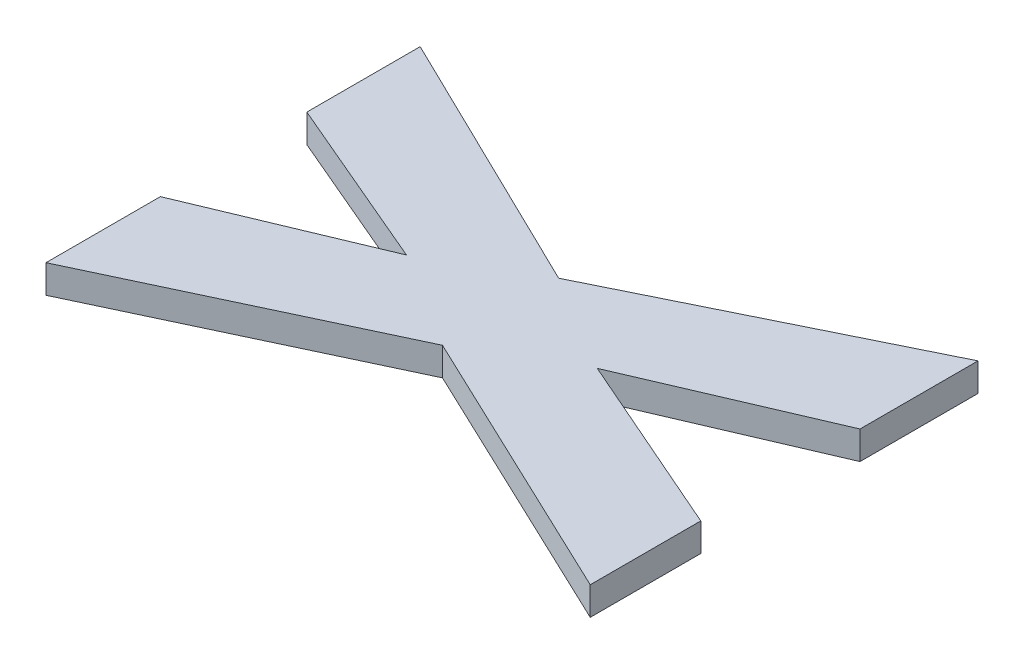
ISO-10303-21;
HEADER;
FILE_DESCRIPTION(('STEP AP214'),'2;1');
FILE_NAME('part.step','',(''),(''),'','','');
FILE_SCHEMA(('AUTOMOTIVE_DESIGN { 1 0 10303 214 1 1 1 1 }'));
ENDSEC;
DATA;
#1=APPLICATION_CONTEXT('core data for automotive mechanical design processes');
#2=APPLICATION_PROTOCOL_DEFINITION('international standard','automotive_design',2000,#1);
#3=PRODUCT_CONTEXT('',#1,'mechanical');
#4=PRODUCT('Part','Part','',(#3));
#5=PRODUCT_RELATED_PRODUCT_CATEGORY('part','',(#4));
#6=PRODUCT_DEFINITION_FORMATION('','',#4);
#7=PRODUCT_DEFINITION_CONTEXT('part definition',#1,'design');
#8=PRODUCT_DEFINITION('design','',#6,#7);
#9=PRODUCT_DEFINITION_SHAPE('','',#8);
#10=(LENGTH_UNIT() NAMED_UNIT(*) SI_UNIT(.MILLI.,.METRE.));
#11=(NAMED_UNIT(*) PLANE_ANGLE_UNIT() SI_UNIT($,.RADIAN.));
#12=(NAMED_UNIT(*) SI_UNIT($,.STERADIAN.) SOLID_ANGLE_UNIT());
#13=UNCERTAINTY_MEASURE_WITH_UNIT(LENGTH_MEASURE(1.E-05),#10,'distance_accuracy_value','');
#14=(GEOMETRIC_REPRESENTATION_CONTEXT(3) GLOBAL_UNCERTAINTY_ASSIGNED_CONTEXT((#13)) GLOBAL_UNIT_ASSIGNED_CONTEXT((#10,
#11,#12)) REPRESENTATION_CONTEXT('',''));
#15=CARTESIAN_POINT('',(0.,0.,0.));
#16=DIRECTION('',(0.,0.,1.));
#17=DIRECTION('',(1.,0.,0.));
#18=AXIS2_PLACEMENT_3D('',#15,#16,#17);
#19=CARTESIAN_POINT('',(2.3542541336,2.9906,4.9916557850555));
#20=DIRECTION('',(1.,0.,0.));
#21=DIRECTION('',(0.,-1.,0.));
#22=AXIS2_PLACEMENT_3D('',#19,#20,#21);
#23=PLANE('',#22);
#24=DIRECTION('',(0.,0.,1.));
#25=VECTOR('',#24,1.);
#26=CARTESIAN_POINT('',(2.3542541336,2.9306,4.9916557850555));
#27=LINE('',#26,#25);
#28=CARTESIAN_POINT('',(2.3542541336,2.9306,4.9916557850555));
#29=VERTEX_POINT('',#28);
#30=CARTESIAN_POINT('',(2.3542541336,2.9306,5.2263780072777));
#31=VERTEX_POINT('',#30);
#32=EDGE_CURVE('E11',#29,#31,#27,.T.);
#33=ORIENTED_EDGE('',*,*,#32,.F.);
#34=DIRECTION('',(0.,-1.,0.));
#35=VECTOR('',#34,1.);
#36=CARTESIAN_POINT('',(2.3542541336,2.9906,4.9916557850555));
#37=LINE('',#36,#35);
#38=CARTESIAN_POINT('',(2.3542541336,2.9906,4.9916557850555));
#39=VERTEX_POINT('',#38);
#40=EDGE_CURVE('E24',#39,#29,#37,.T.);
#41=ORIENTED_EDGE('',*,*,#40,.F.);
#42=DIRECTION('',(0.,0.,1.));
#43=VECTOR('',#42,1.);
#44=CARTESIAN_POINT('',(2.3542541336,2.9906,4.9916557850555));
#45=LINE('',#44,#43);
#46=CARTESIAN_POINT('',(2.3542541336,2.9906,5.2263780072777));
#47=VERTEX_POINT('',#46);
#48=EDGE_CURVE('E209',#39,#47,#45,.T.);
#49=ORIENTED_EDGE('',*,*,#48,.T.);
#50=DIRECTION('',(0.,-1.,0.));
#51=VECTOR('',#50,1.);
#52=CARTESIAN_POINT('',(2.3542541336,2.9906,5.2263780072777));
#53=LINE('',#52,#51);
#54=EDGE_CURVE('E126',#47,#31,#53,.T.);
#55=ORIENTED_EDGE('',*,*,#54,.T.);
#56=EDGE_LOOP('',(#33,#41,#49,#55));
#57=FACE_BOUND('',#56,.T.);
#58=ADVANCED_FACE('F17',(#57),#23,.T.);
#59=CARTESIAN_POINT('',(1.9638027447111,2.9906,4.8210307850555));
#60=DIRECTION('',(0.400429795051687,0.,-0.916327441057433));
#61=DIRECTION('',(-0.916327441057433,0.,-0.400429795051687));
#62=AXIS2_PLACEMENT_3D('',#59,#60,#61);
#63=PLANE('',#62);
#64=DIRECTION('',(0.916327441057433,0.,0.400429795051687));
#65=VECTOR('',#64,1.);
#66=CARTESIAN_POINT('',(1.9638027447111,2.9306,4.8210307850555));
#67=LINE('',#66,#65);
#68=CARTESIAN_POINT('',(1.9638027447111,2.9306,4.8210307850555));
#69=VERTEX_POINT('',#68);
#70=EDGE_CURVE('E206',#69,#29,#67,.T.);
#71=ORIENTED_EDGE('',*,*,#70,.F.);
#72=DIRECTION('',(0.,-1.,0.));
#73=VECTOR('',#72,1.);
#74=CARTESIAN_POINT('',(1.9638027447111,2.9906,4.8210307850555));
#75=LINE('',#74,#73);
#76=CARTESIAN_POINT('',(1.9638027447111,2.9906,4.8210307850555));
#77=VERTEX_POINT('',#76);
#78=EDGE_CURVE('E203',#77,#69,#75,.T.);
#79=ORIENTED_EDGE('',*,*,#78,.F.);
#80=DIRECTION('',(0.916327441057433,0.,0.400429795051687));
#81=VECTOR('',#80,1.);
#82=CARTESIAN_POINT('',(1.9638027447111,2.9906,4.8210307850555));
#83=LINE('',#82,#81);
#84=EDGE_CURVE('E200',#77,#39,#83,.T.);
#85=ORIENTED_EDGE('',*,*,#84,.T.);
#86=ORIENTED_EDGE('',*,*,#40,.T.);
#87=EDGE_LOOP('',(#71,#79,#85,#86));
#88=FACE_BOUND('',#87,.T.);
#89=ADVANCED_FACE('F211',(#88),#63,.T.);
#90=CARTESIAN_POINT('',(2.3542541336,2.9906,4.6535655072777));
#91=DIRECTION('',(0.394175741112366,0.,0.919035083725598));
#92=DIRECTION('',(0.919035083725598,0.,-0.394175741112366));
#93=AXIS2_PLACEMENT_3D('',#90,#91,#92);
#94=PLANE('',#93);
#95=DIRECTION('',(-0.919035083725598,0.,0.394175741112366));
#96=VECTOR('',#95,1.);
#97=CARTESIAN_POINT('',(2.3542541336,2.9306,4.6535655072777));
#98=LINE('',#97,#96);
#99=CARTESIAN_POINT('',(2.3542541336,2.9306,4.6535655072777));
#100=VERTEX_POINT('',#99);
#101=EDGE_CURVE('E197',#100,#69,#98,.T.);
#102=ORIENTED_EDGE('',*,*,#101,.F.);
#103=DIRECTION('',(0.,-1.,0.));
#104=VECTOR('',#103,1.);
#105=CARTESIAN_POINT('',(2.3542541336,2.9906,4.6535655072777));
#106=LINE('',#105,#104);
#107=CARTESIAN_POINT('',(2.3542541336,2.9906,4.6535655072777));
#108=VERTEX_POINT('',#107);
#109=EDGE_CURVE('E194',#108,#100,#106,.T.);
#110=ORIENTED_EDGE('',*,*,#109,.F.);
#111=DIRECTION('',(-0.919035083725598,0.,0.394175741112366));
#112=VECTOR('',#111,1.);
#113=CARTESIAN_POINT('',(2.3542541336,2.9906,4.6535655072777));
#114=LINE('',#113,#112);
#115=EDGE_CURVE('E191',#108,#77,#114,.T.);
#116=ORIENTED_EDGE('',*,*,#115,.T.);
#117=ORIENTED_EDGE('',*,*,#78,.T.);
#118=EDGE_LOOP('',(#102,#110,#116,#117));
#119=FACE_BOUND('',#118,.T.);
#120=ADVANCED_FACE('F215',(#119),#94,.T.);
#121=CARTESIAN_POINT('',(2.3542541336,2.9906,4.4030446739444));
#122=DIRECTION('',(1.,0.,0.));
#123=DIRECTION('',(0.,-1.,0.));
#124=AXIS2_PLACEMENT_3D('',#121,#122,#123);
#125=PLANE('',#124);
#126=DIRECTION('',(0.,0.,1.));
#127=VECTOR('',#126,1.);
#128=CARTESIAN_POINT('',(2.3542541336,2.9306,4.4030446739444));
#129=LINE('',#128,#127);
#130=CARTESIAN_POINT('',(2.3542541336,2.9306,4.4030446739444));
#131=VERTEX_POINT('',#130);
#132=EDGE_CURVE('E188',#131,#100,#129,.T.);
#133=ORIENTED_EDGE('',*,*,#132,.F.);
#134=DIRECTION('',(0.,-1.,0.));
#135=VECTOR('',#134,1.);
#136=CARTESIAN_POINT('',(2.3542541336,2.9906,4.4030446739444));
#137=LINE('',#136,#135);
#138=CARTESIAN_POINT('',(2.3542541336,2.9906,4.4030446739444));
#139=VERTEX_POINT('',#138);
#140=EDGE_CURVE('E185',#139,#131,#137,.T.);
#141=ORIENTED_EDGE('',*,*,#140,.F.);
#142=DIRECTION('',(0.,0.,1.));
#143=VECTOR('',#142,1.);
#144=CARTESIAN_POINT('',(2.3542541336,2.9906,4.4030446739444));
#145=LINE('',#144,#143);
#146=EDGE_CURVE('E182',#139,#108,#145,.T.);
#147=ORIENTED_EDGE('',*,*,#146,.T.);
#148=ORIENTED_EDGE('',*,*,#109,.T.);
#149=EDGE_LOOP('',(#133,#141,#147,#148));
#150=FACE_BOUND('',#149,.T.);
#151=ADVANCED_FACE('F218',(#150),#125,.T.);
#152=CARTESIAN_POINT('',(1.7570666336,2.9906,4.6962217572777));
#153=DIRECTION('',(-0.440688101753024,0.,-0.897660290406854));
#154=DIRECTION('',(-0.897660290406854,0.,0.440688101753024));
#155=AXIS2_PLACEMENT_3D('',#152,#153,#154);
#156=PLANE('',#155);
#157=DIRECTION('',(0.897660290406854,0.,-0.440688101753024));
#158=VECTOR('',#157,1.);
#159=CARTESIAN_POINT('',(1.7570666336,2.9306,4.6962217572777));
#160=LINE('',#159,#158);
#161=CARTESIAN_POINT('',(1.7570666336,2.9306,4.6962217572777));
#162=VERTEX_POINT('',#161);
#163=EDGE_CURVE('E179',#162,#131,#160,.T.);
#164=ORIENTED_EDGE('',*,*,#163,.F.);
#165=DIRECTION('',(0.,-1.,0.));
#166=VECTOR('',#165,1.);
#167=CARTESIAN_POINT('',(1.7570666336,2.9906,4.6962217572777));
#168=LINE('',#167,#166);
#169=CARTESIAN_POINT('',(1.7570666336,2.9906,4.6962217572777));
#170=VERTEX_POINT('',#169);
#171=EDGE_CURVE('E176',#170,#162,#168,.T.);
#172=ORIENTED_EDGE('',*,*,#171,.F.);
#173=DIRECTION('',(0.897660290406854,0.,-0.440688101753024));
#174=VECTOR('',#173,1.);
#175=CARTESIAN_POINT('',(1.7570666336,2.9906,4.6962217572777));
#176=LINE('',#175,#174);
#177=EDGE_CURVE('E173',#170,#139,#176,.T.);
#178=ORIENTED_EDGE('',*,*,#177,.T.);
#179=ORIENTED_EDGE('',*,*,#140,.T.);
#180=EDGE_LOOP('',(#164,#172,#178,#179));
#181=FACE_BOUND('',#180,.T.);
#182=ADVANCED_FACE('F223',(#181),#156,.T.);
#183=CARTESIAN_POINT('',(1.1842541336,2.9906,4.4174891183888));
#184=DIRECTION('',(0.437550889322182,0.,-0.899193649473442));
#185=DIRECTION('',(-0.899193649473442,0.,-0.437550889322182));
#186=AXIS2_PLACEMENT_3D('',#183,#184,#185);
#187=PLANE('',#186);
#188=DIRECTION('',(0.899193649473442,0.,0.437550889322182));
#189=VECTOR('',#188,1.);
#190=CARTESIAN_POINT('',(1.1842541336,2.9306,4.4174891183888));
#191=LINE('',#190,#189);
#192=CARTESIAN_POINT('',(1.1842541336,2.9306,4.4174891183888));
#193=VERTEX_POINT('',#192);
#194=EDGE_CURVE('E170',#193,#162,#191,.T.);
#195=ORIENTED_EDGE('',*,*,#194,.F.);
#196=DIRECTION('',(0.,-1.,0.));
#197=VECTOR('',#196,1.);
#198=CARTESIAN_POINT('',(1.1842541336,2.9906,4.4174891183888));
#199=LINE('',#198,#197);
#200=CARTESIAN_POINT('',(1.1842541336,2.9906,4.4174891183888));
#201=VERTEX_POINT('',#200);
#202=EDGE_CURVE('E167',#201,#193,#199,.T.);
#203=ORIENTED_EDGE('',*,*,#202,.F.);
#204=DIRECTION('',(0.899193649473442,0.,0.437550889322182));
#205=VECTOR('',#204,1.);
#206=CARTESIAN_POINT('',(1.1842541336,2.9906,4.4174891183888));
#207=LINE('',#206,#205);
#208=EDGE_CURVE('E164',#201,#170,#207,.T.);
#209=ORIENTED_EDGE('',*,*,#208,.T.);
#210=ORIENTED_EDGE('',*,*,#171,.T.);
#211=EDGE_LOOP('',(#195,#203,#209,#210));
#212=FACE_BOUND('',#211,.T.);
#213=ADVANCED_FACE('F225',(#212),#187,.T.);
#214=CARTESIAN_POINT('',(1.1842541336,2.9906,4.6580793961666));
#215=DIRECTION('',(-1.,0.,0.));
#216=DIRECTION('',(0.,1.,0.));
#217=AXIS2_PLACEMENT_3D('',#214,#215,#216);
#218=PLANE('',#217);
#219=DIRECTION('',(0.,0.,-1.));
#220=VECTOR('',#219,1.);
#221=CARTESIAN_POINT('',(1.1842541336,2.9306,4.6580793961666));
#222=LINE('',#221,#220);
#223=CARTESIAN_POINT('',(1.1842541336,2.9306,4.6580793961666));
#224=VERTEX_POINT('',#223);
#225=EDGE_CURVE('E161',#224,#193,#222,.T.);
#226=ORIENTED_EDGE('',*,*,#225,.F.);
#227=DIRECTION('',(0.,-1.,0.));
#228=VECTOR('',#227,1.);
#229=CARTESIAN_POINT('',(1.1842541336,2.9906,4.6580793961666));
#230=LINE('',#229,#228);
#231=CARTESIAN_POINT('',(1.1842541336,2.9906,4.6580793961666));
#232=VERTEX_POINT('',#231);
#233=EDGE_CURVE('E158',#232,#224,#230,.T.);
#234=ORIENTED_EDGE('',*,*,#233,.F.);
#235=DIRECTION('',(0.,0.,-1.));
#236=VECTOR('',#235,1.);
#237=CARTESIAN_POINT('',(1.1842541336,2.9906,4.6580793961666));
#238=LINE('',#237,#236);
#239=EDGE_CURVE('E155',#232,#201,#238,.T.);
#240=ORIENTED_EDGE('',*,*,#239,.T.);
#241=ORIENTED_EDGE('',*,*,#202,.T.);
#242=EDGE_LOOP('',(#226,#234,#240,#241));
#243=FACE_BOUND('',#242,.T.);
#244=ADVANCED_FACE('F227',(#243),#218,.T.);
#245=CARTESIAN_POINT('',(1.5528131613777,2.9906,4.8151627294999));
#246=DIRECTION('',(-0.39208281014381,0.,0.919929926673621));
#247=DIRECTION('',(0.919929926673621,0.,0.39208281014381));
#248=AXIS2_PLACEMENT_3D('',#245,#246,#247);
#249=PLANE('',#248);
#250=DIRECTION('',(-0.919929926673621,0.,-0.39208281014381));
#251=VECTOR('',#250,1.);
#252=CARTESIAN_POINT('',(1.5528131613777,2.9306,4.8151627294999));
#253=LINE('',#252,#251);
#254=CARTESIAN_POINT('',(1.5528131613777,2.9306,4.8151627294999));
#255=VERTEX_POINT('',#254);
#256=EDGE_CURVE('E152',#255,#224,#253,.T.);
#257=ORIENTED_EDGE('',*,*,#256,.F.);
#258=DIRECTION('',(0.,-1.,0.));
#259=VECTOR('',#258,1.);
#260=CARTESIAN_POINT('',(1.5528131613777,2.9906,4.8151627294999));
#261=LINE('',#260,#259);
#262=CARTESIAN_POINT('',(1.5528131613777,2.9906,4.8151627294999));
#263=VERTEX_POINT('',#262);
#264=EDGE_CURVE('E149',#263,#255,#261,.T.);
#265=ORIENTED_EDGE('',*,*,#264,.F.);
#266=DIRECTION('',(-0.919929926673621,0.,-0.39208281014381));
#267=VECTOR('',#266,1.);
#268=CARTESIAN_POINT('',(1.5528131613777,2.9906,4.8151627294999));
#269=LINE('',#268,#267);
#270=EDGE_CURVE('E146',#263,#232,#269,.T.);
#271=ORIENTED_EDGE('',*,*,#270,.T.);
#272=ORIENTED_EDGE('',*,*,#233,.T.);
#273=EDGE_LOOP('',(#257,#265,#271,#272));
#274=FACE_BOUND('',#273,.T.);
#275=ADVANCED_FACE('F230',(#274),#249,.T.);
#276=CARTESIAN_POINT('',(1.1842541336,2.9906,4.969086340611));
#277=DIRECTION('',(-0.385377596123312,0.,-0.922758965497609));
#278=DIRECTION('',(-0.922758965497609,0.,0.385377596123312));
#279=AXIS2_PLACEMENT_3D('',#276,#277,#278);
#280=PLANE('',#279);
#281=DIRECTION('',(0.922758965497609,0.,-0.385377596123312));
#282=VECTOR('',#281,1.);
#283=CARTESIAN_POINT('',(1.1842541336,2.9306,4.969086340611));
#284=LINE('',#283,#282);
#285=CARTESIAN_POINT('',(1.1842541336,2.9306,4.969086340611));
#286=VERTEX_POINT('',#285);
#287=EDGE_CURVE('E143',#286,#255,#284,.T.);
#288=ORIENTED_EDGE('',*,*,#287,.F.);
#289=DIRECTION('',(0.,-1.,0.));
#290=VECTOR('',#289,1.);
#291=CARTESIAN_POINT('',(1.1842541336,2.9906,4.969086340611));
#292=LINE('',#291,#290);
#293=CARTESIAN_POINT('',(1.1842541336,2.9906,4.969086340611));
#294=VERTEX_POINT('',#293);
#295=EDGE_CURVE('E140',#294,#286,#292,.T.);
#296=ORIENTED_EDGE('',*,*,#295,.F.);
#297=DIRECTION('',(0.922758965497609,0.,-0.385377596123312));
#298=VECTOR('',#297,1.);
#299=CARTESIAN_POINT('',(1.1842541336,2.9906,4.969086340611));
#300=LINE('',#299,#298);
#301=EDGE_CURVE('E137',#294,#263,#300,.T.);
#302=ORIENTED_EDGE('',*,*,#301,.T.);
#303=ORIENTED_EDGE('',*,*,#264,.T.);
#304=EDGE_LOOP('',(#288,#296,#302,#303));
#305=FACE_BOUND('',#304,.T.);
#306=ADVANCED_FACE('F233',(#305),#280,.T.);
#307=CARTESIAN_POINT('',(1.1842541336,2.9906,5.2119335628332));
#308=DIRECTION('',(-1.,0.,0.));
#309=DIRECTION('',(0.,1.,0.));
#310=AXIS2_PLACEMENT_3D('',#307,#308,#309);
#311=PLANE('',#310);
#312=DIRECTION('',(0.,0.,-1.));
#313=VECTOR('',#312,1.);
#314=CARTESIAN_POINT('',(1.1842541336,2.9306,5.2119335628332));
#315=LINE('',#314,#313);
#316=CARTESIAN_POINT('',(1.1842541336,2.9306,5.2119335628332));
#317=VERTEX_POINT('',#316);
#318=EDGE_CURVE('E134',#317,#286,#315,.T.);
#319=ORIENTED_EDGE('',*,*,#318,.F.);
#320=DIRECTION('',(0.,-1.,0.));
#321=VECTOR('',#320,1.);
#322=CARTESIAN_POINT('',(1.1842541336,2.9906,5.2119335628332));
#323=LINE('',#322,#321);
#324=CARTESIAN_POINT('',(1.1842541336,2.9906,5.2119335628332));
#325=VERTEX_POINT('',#324);
#326=EDGE_CURVE('E132',#325,#317,#323,.T.);
#327=ORIENTED_EDGE('',*,*,#326,.F.);
#328=DIRECTION('',(0.,0.,-1.));
#329=VECTOR('',#328,1.);
#330=CARTESIAN_POINT('',(1.1842541336,2.9906,5.2119335628332));
#331=LINE('',#330,#329);
#332=EDGE_CURVE('E121',#325,#294,#331,.T.);
#333=ORIENTED_EDGE('',*,*,#332,.T.);
#334=ORIENTED_EDGE('',*,*,#295,.T.);
#335=EDGE_LOOP('',(#319,#327,#333,#334));
#336=FACE_BOUND('',#335,.T.);
#337=ADVANCED_FACE('F235',(#336),#311,.T.);
#338=CARTESIAN_POINT('',(1.7570666336,2.9906,4.9429057850555));
#339=DIRECTION('',(0.425109909729269,0.,0.905141737326245));
#340=DIRECTION('',(0.905141737326245,0.,-0.425109909729269));
#341=AXIS2_PLACEMENT_3D('',#338,#339,#340);
#342=PLANE('',#341);
#343=DIRECTION('',(-0.905141737326245,0.,0.425109909729269));
#344=VECTOR('',#343,1.);
#345=CARTESIAN_POINT('',(1.7570666336,2.9306,4.9429057850555));
#346=LINE('',#345,#344);
#347=CARTESIAN_POINT('',(1.7570666336,2.9306,4.9429057850555));
#348=VERTEX_POINT('',#347);
#349=EDGE_CURVE('E108',#348,#317,#346,.T.);
#350=ORIENTED_EDGE('',*,*,#349,.F.);
#351=DIRECTION('',(0.,-1.,0.));
#352=VECTOR('',#351,1.);
#353=CARTESIAN_POINT('',(1.7570666336,2.9906,4.9429057850555));
#354=LINE('',#353,#352);
#355=CARTESIAN_POINT('',(1.7570666336,2.9906,4.9429057850555));
#356=VERTEX_POINT('',#355);
#357=EDGE_CURVE('E102',#356,#348,#354,.T.);
#358=ORIENTED_EDGE('',*,*,#357,.F.);
#359=DIRECTION('',(-0.905141737326245,0.,0.425109909729269));
#360=VECTOR('',#359,1.);
#361=CARTESIAN_POINT('',(1.7570666336,2.9906,4.9429057850555));
#362=LINE('',#361,#360);
#363=EDGE_CURVE('E106',#356,#325,#362,.T.);
#364=ORIENTED_EDGE('',*,*,#363,.T.);
#365=ORIENTED_EDGE('',*,*,#326,.T.);
#366=EDGE_LOOP('',(#350,#358,#364,#365));
#367=FACE_BOUND('',#366,.T.);
#368=ADVANCED_FACE('F104',(#367),#342,.T.);
#369=CARTESIAN_POINT('',(2.3542541336,2.9906,5.2263780072777));
#370=DIRECTION('',(-0.4288200188943,0.,0.903389944262992));
#371=DIRECTION('',(0.903389944262992,0.,0.4288200188943));
#372=AXIS2_PLACEMENT_3D('',#369,#370,#371);
#373=PLANE('',#372);
#374=DIRECTION('',(-0.903389944262992,0.,-0.4288200188943));
#375=VECTOR('',#374,1.);
#376=CARTESIAN_POINT('',(2.3542541336,2.9306,5.2263780072777));
#377=LINE('',#376,#375);
#378=EDGE_CURVE('E122',#31,#348,#377,.T.);
#379=ORIENTED_EDGE('',*,*,#378,.F.);
#380=ORIENTED_EDGE('',*,*,#54,.F.);
#381=DIRECTION('',(-0.903389944262992,0.,-0.4288200188943));
#382=VECTOR('',#381,1.);
#383=CARTESIAN_POINT('',(2.3542541336,2.9906,5.2263780072777));
#384=LINE('',#383,#382);
#385=EDGE_CURVE('E118',#47,#356,#384,.T.);
#386=ORIENTED_EDGE('',*,*,#385,.T.);
#387=ORIENTED_EDGE('',*,*,#357,.T.);
#388=EDGE_LOOP('',(#379,#380,#386,#387));
#389=FACE_BOUND('',#388,.T.);
#390=ADVANCED_FACE('F125',(#389),#373,.T.);
#391=CARTESIAN_POINT('',(0.,2.9906,0.));
#392=DIRECTION('',(0.,1.,0.));
#393=DIRECTION('',(1.,0.,0.));
#394=AXIS2_PLACEMENT_3D('',#391,#392,#393);
#395=PLANE('',#394);
#396=ORIENTED_EDGE('',*,*,#48,.F.);
#397=ORIENTED_EDGE('',*,*,#84,.F.);
#398=ORIENTED_EDGE('',*,*,#115,.F.);
#399=ORIENTED_EDGE('',*,*,#146,.F.);
#400=ORIENTED_EDGE('',*,*,#177,.F.);
#401=ORIENTED_EDGE('',*,*,#208,.F.);
#402=ORIENTED_EDGE('',*,*,#239,.F.);
#403=ORIENTED_EDGE('',*,*,#270,.F.);
#404=ORIENTED_EDGE('',*,*,#301,.F.);
#405=ORIENTED_EDGE('',*,*,#332,.F.);
#406=ORIENTED_EDGE('',*,*,#363,.F.);
#407=ORIENTED_EDGE('',*,*,#385,.F.);
#408=EDGE_LOOP('',(#396,#397,#398,#399,#400,#401,#402,#403,#404,#405,#406,#407));
#409=FACE_BOUND('',#408,.T.);
#410=ADVANCED_FACE('F117',(#409),#395,.T.);
#411=CARTESIAN_POINT('',(0.,2.9306,0.));
#412=DIRECTION('',(0.,1.,0.));
#413=DIRECTION('',(1.,0.,0.));
#414=AXIS2_PLACEMENT_3D('',#411,#412,#413);
#415=PLANE('',#414);
#416=ORIENTED_EDGE('',*,*,#32,.T.);
#417=ORIENTED_EDGE('',*,*,#378,.T.);
#418=ORIENTED_EDGE('',*,*,#349,.T.);
#419=ORIENTED_EDGE('',*,*,#318,.T.);
#420=ORIENTED_EDGE('',*,*,#287,.T.);
#421=ORIENTED_EDGE('',*,*,#256,.T.);
#422=ORIENTED_EDGE('',*,*,#225,.T.);
#423=ORIENTED_EDGE('',*,*,#194,.T.);
#424=ORIENTED_EDGE('',*,*,#163,.T.);
#425=ORIENTED_EDGE('',*,*,#132,.T.);
#426=ORIENTED_EDGE('',*,*,#101,.T.);
#427=ORIENTED_EDGE('',*,*,#70,.T.);
#428=EDGE_LOOP('',(#416,#417,#418,#419,#420,#421,#422,#423,#424,#425,#426,#427));
#429=FACE_BOUND('',#428,.T.);
#430=ADVANCED_FACE('F213',(#429),#415,.F.);
#431=CLOSED_SHELL('',(#58,#89,#120,#151,#182,#213,#244,#275,#306,#337,#368,#390,#410,#430));
#432=MANIFOLD_SOLID_BREP('B1',#431);
#433=ADVANCED_BREP_SHAPE_REPRESENTATION('',(#18,#432),#14);
#434=SHAPE_DEFINITION_REPRESENTATION(#9,#433);
ENDSEC;
END-ISO-10303-21;
